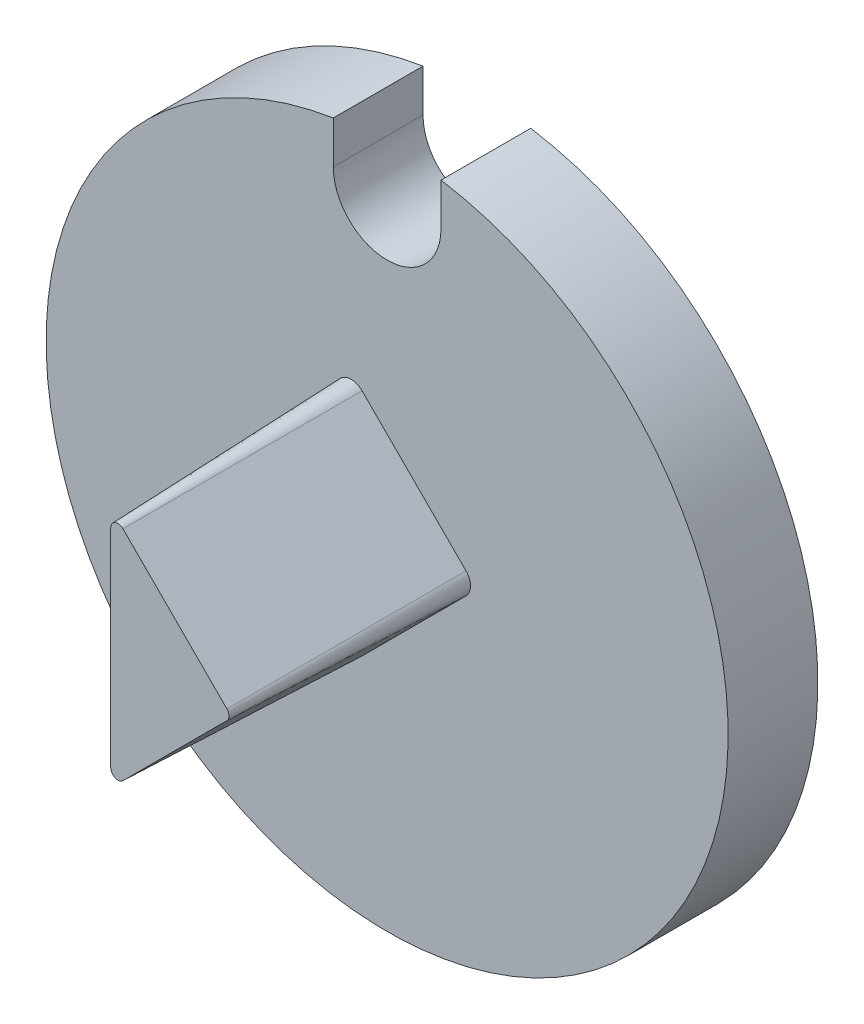
ISO-10303-21;
HEADER;
FILE_DESCRIPTION(('STEP AP214'),'2;1');
FILE_NAME('part.step','',(''),(''),'','','');
FILE_SCHEMA(('AUTOMOTIVE_DESIGN { 1 0 10303 214 1 1 1 1 }'));
ENDSEC;
DATA;
#1=APPLICATION_CONTEXT('core data for automotive mechanical design processes');
#2=APPLICATION_PROTOCOL_DEFINITION('international standard','automotive_design',2000,#1);
#3=PRODUCT_CONTEXT('',#1,'mechanical');
#4=PRODUCT('Part','Part','',(#3));
#5=PRODUCT_RELATED_PRODUCT_CATEGORY('part','',(#4));
#6=PRODUCT_DEFINITION_FORMATION('','',#4);
#7=PRODUCT_DEFINITION_CONTEXT('part definition',#1,'design');
#8=PRODUCT_DEFINITION('design','',#6,#7);
#9=PRODUCT_DEFINITION_SHAPE('','',#8);
#10=(LENGTH_UNIT() NAMED_UNIT(*) SI_UNIT(.MILLI.,.METRE.));
#11=(NAMED_UNIT(*) PLANE_ANGLE_UNIT() SI_UNIT($,.RADIAN.));
#12=(NAMED_UNIT(*) SI_UNIT($,.STERADIAN.) SOLID_ANGLE_UNIT());
#13=UNCERTAINTY_MEASURE_WITH_UNIT(LENGTH_MEASURE(1.E-05),#10,'distance_accuracy_value','');
#14=(GEOMETRIC_REPRESENTATION_CONTEXT(3) GLOBAL_UNCERTAINTY_ASSIGNED_CONTEXT((#13)) GLOBAL_UNIT_ASSIGNED_CONTEXT((#10,
#11,#12)) REPRESENTATION_CONTEXT('',''));
#15=CARTESIAN_POINT('',(0.,0.,0.));
#16=DIRECTION('',(0.,0.,1.));
#17=DIRECTION('',(1.,0.,0.));
#18=AXIS2_PLACEMENT_3D('',#15,#16,#17);
#19=CARTESIAN_POINT('',(1.89644660940672,0.,2.50000000005457));
#20=DIRECTION('',(0.,0.,-1.));
#21=DIRECTION('',(-1.,0.,0.));
#22=AXIS2_PLACEMENT_3D('',#19,#20,#21);
#23=CONICAL_SURFACE('',#22,0.426985001696213,0.0349065850400188);
#24=DIRECTION('',(-0.0246776707783359,0.0246776707783359,0.999390827019096));
#25=VECTOR('',#24,1.);
#26=CARTESIAN_POINT('',(2.03786796564404,-0.141421356237313,9.));
#27=LINE('',#26,#25);
#28=CARTESIAN_POINT('',(2.1983705995712,-0.301923990164476,2.49999999999886));
#29=VERTEX_POINT('',#28);
#30=CARTESIAN_POINT('',(2.03786796564386,-0.141421356237134,9.00000000000728));
#31=VERTEX_POINT('',#30);
#32=EDGE_CURVE('E98',#29,#31,#27,.T.);
#33=ORIENTED_EDGE('',*,*,#32,.F.);
#34=CARTESIAN_POINT('',(1.89644660940672,0.,2.49999999999773));
#35=DIRECTION('',(0.,0.,-1.));
#36=DIRECTION('',(-1.,0.,0.));
#37=AXIS2_PLACEMENT_3D('',#34,#35,#36);
#38=CIRCLE('',#37,0.426985001698198);
#39=CARTESIAN_POINT('',(2.1983705995712,0.301923990164474,2.49999999999886));
#40=VERTEX_POINT('',#39);
#41=EDGE_CURVE('E20',#29,#40,#38,.F.);
#42=ORIENTED_EDGE('',*,*,#41,.T.);
#43=DIRECTION('',(-0.0246776707783359,-0.024677670778336,0.999390827019096));
#44=VECTOR('',#43,1.);
#45=CARTESIAN_POINT('',(2.03786796564404,0.141421356237311,9.));
#46=LINE('',#45,#44);
#47=CARTESIAN_POINT('',(2.03786796564386,0.141421356237131,9.00000000000728));
#48=VERTEX_POINT('',#47);
#49=EDGE_CURVE('E97',#48,#40,#46,.F.);
#50=ORIENTED_EDGE('',*,*,#49,.F.);
#51=CARTESIAN_POINT('',(1.89644660940672,0.,9.00000000001455));
#52=DIRECTION('',(0.,0.,-1.));
#53=DIRECTION('',(-1.,0.,0.));
#54=AXIS2_PLACEMENT_3D('',#51,#52,#53);
#55=CIRCLE('',#54,0.20000000000039);
#56=EDGE_CURVE('E160',#31,#48,#55,.F.);
#57=ORIENTED_EDGE('',*,*,#56,.F.);
#58=EDGE_LOOP('',(#33,#42,#50,#57));
#59=FACE_BOUND('',#58,.T.);
#60=ADVANCED_FACE('F17',(#59),#23,.T.);
#61=CARTESIAN_POINT('',(-1.,-2.89644660940673,2.50000000005457));
#62=DIRECTION('',(0.,0.,-1.));
#63=DIRECTION('',(-1.,0.,0.));
#64=AXIS2_PLACEMENT_3D('',#61,#62,#63);
#65=CONICAL_SURFACE('',#64,0.426985001694135,0.0349065850400188);
#66=DIRECTION('',(0.0348994967025009,0.,0.999390827019096));
#67=VECTOR('',#66,1.);
#68=CARTESIAN_POINT('',(-1.2,-2.89644660940673,9.));
#69=LINE('',#68,#67);
#70=CARTESIAN_POINT('',(-1.4269850016964,-2.89644660940673,2.49999999999886));
#71=VERTEX_POINT('',#70);
#72=CARTESIAN_POINT('',(-1.19999999999975,-2.89644660940673,9.00000000000728));
#73=VERTEX_POINT('',#72);
#74=EDGE_CURVE('E129',#71,#73,#69,.T.);
#75=ORIENTED_EDGE('',*,*,#74,.F.);
#76=CARTESIAN_POINT('',(-1.,-2.89644660940673,2.49999999999773));
#77=DIRECTION('',(0.,0.,-1.));
#78=DIRECTION('',(-1.,0.,0.));
#79=AXIS2_PLACEMENT_3D('',#76,#77,#78);
#80=CIRCLE('',#79,0.42698500169612);
#81=CARTESIAN_POINT('',(-0.698076009835526,-3.1983705995712,2.49999999999886));
#82=VERTEX_POINT('',#81);
#83=EDGE_CURVE('E100',#71,#82,#80,.F.);
#84=ORIENTED_EDGE('',*,*,#83,.T.);
#85=DIRECTION('',(-0.0246776707783359,0.0246776707783359,0.999390827019096));
#86=VECTOR('',#85,1.);
#87=CARTESIAN_POINT('',(-0.85857864376269,-3.03786796564404,9.));
#88=LINE('',#87,#86);
#89=CARTESIAN_POINT('',(-0.85857864376287,-3.03786796564386,9.00000000000728));
#90=VERTEX_POINT('',#89);
#91=EDGE_CURVE('E132',#90,#82,#88,.F.);
#92=ORIENTED_EDGE('',*,*,#91,.F.);
#93=CARTESIAN_POINT('',(-1.,-2.89644660940673,9.00000000001455));
#94=DIRECTION('',(0.,0.,-1.));
#95=DIRECTION('',(-1.,0.,0.));
#96=AXIS2_PLACEMENT_3D('',#93,#94,#95);
#97=CIRCLE('',#96,0.199999999998312);
#98=EDGE_CURVE('E158',#73,#90,#97,.F.);
#99=ORIENTED_EDGE('',*,*,#98,.F.);
#100=EDGE_LOOP('',(#75,#84,#92,#99));
#101=FACE_BOUND('',#100,.T.);
#102=ADVANCED_FACE('F164',(#101),#65,.T.);
#103=CARTESIAN_POINT('',(0.,-0.059584240176571,9.));
#104=DIRECTION('',(0.,0.,1.));
#105=DIRECTION('',(1.,0.,0.));
#106=AXIS2_PLACEMENT_3D('',#103,#104,#105);
#107=PLANE('',#106);
#108=ORIENTED_EDGE('',*,*,#98,.T.);
#109=DIRECTION('',(0.707106781186547,0.707106781186547,0.));
#110=VECTOR('',#109,1.);
#111=CARTESIAN_POINT('',(1.05985254085239,-1.11943678102896,9.));
#112=LINE('',#111,#110);
#113=EDGE_CURVE('E136',#31,#90,#112,.F.);
#114=ORIENTED_EDGE('',*,*,#113,.F.);
#115=ORIENTED_EDGE('',*,*,#56,.T.);
#116=DIRECTION('',(-0.707106781186548,0.707106781186547,0.));
#117=VECTOR('',#116,1.);
#118=CARTESIAN_POINT('',(1.11943678102896,1.05985254085239,9.));
#119=LINE('',#118,#117);
#120=CARTESIAN_POINT('',(-0.858578643762873,3.03786796564386,9.00000000000728));
#121=VERTEX_POINT('',#120);
#122=EDGE_CURVE('E108',#121,#48,#119,.F.);
#123=ORIENTED_EDGE('',*,*,#122,.F.);
#124=CARTESIAN_POINT('',(-1.,2.89644660940673,9.00000000001455));
#125=DIRECTION('',(0.,0.,-1.));
#126=DIRECTION('',(-1.,0.,0.));
#127=AXIS2_PLACEMENT_3D('',#124,#125,#126);
#128=CIRCLE('',#127,0.199999999998312);
#129=CARTESIAN_POINT('',(-1.19999999999975,2.89644660940673,9.00000000000728));
#130=VERTEX_POINT('',#129);
#131=EDGE_CURVE('E156',#130,#121,#128,.T.);
#132=ORIENTED_EDGE('',*,*,#131,.F.);
#133=DIRECTION('',(0.,1.,0.));
#134=VECTOR('',#133,1.);
#135=CARTESIAN_POINT('',(-1.2,-0.0595842401765708,9.));
#136=LINE('',#135,#134);
#137=EDGE_CURVE('E131',#73,#130,#136,.T.);
#138=ORIENTED_EDGE('',*,*,#137,.F.);
#139=EDGE_LOOP('',(#108,#114,#115,#123,#132,#138));
#140=FACE_BOUND('',#139,.T.);
#141=ADVANCED_FACE('F171',(#140),#107,.T.);
#142=CARTESIAN_POINT('',(-1.,2.89644660940673,2.50000000005457));
#143=DIRECTION('',(0.,0.,-1.));
#144=DIRECTION('',(-1.,0.,0.));
#145=AXIS2_PLACEMENT_3D('',#142,#143,#144);
#146=CONICAL_SURFACE('',#145,0.426985001694135,0.0349065850400188);
#147=DIRECTION('',(-0.0246776707783359,-0.024677670778336,0.999390827019096));
#148=VECTOR('',#147,1.);
#149=CARTESIAN_POINT('',(-0.858578643762693,3.03786796564404,9.));
#150=LINE('',#149,#148);
#151=CARTESIAN_POINT('',(-0.698076009835529,3.1983705995712,2.49999999999886));
#152=VERTEX_POINT('',#151);
#153=EDGE_CURVE('E139',#152,#121,#150,.T.);
#154=ORIENTED_EDGE('',*,*,#153,.F.);
#155=CARTESIAN_POINT('',(-1.,2.89644660940673,2.49999999999773));
#156=DIRECTION('',(0.,0.,-1.));
#157=DIRECTION('',(-1.,0.,0.));
#158=AXIS2_PLACEMENT_3D('',#155,#156,#157);
#159=CIRCLE('',#158,0.42698500169612);
#160=CARTESIAN_POINT('',(-1.4269850016964,2.89644660940673,2.49999999999886));
#161=VERTEX_POINT('',#160);
#162=EDGE_CURVE('E113',#152,#161,#159,.F.);
#163=ORIENTED_EDGE('',*,*,#162,.T.);
#164=DIRECTION('',(0.0348994967025009,0.,0.999390827019096));
#165=VECTOR('',#164,1.);
#166=CARTESIAN_POINT('',(-1.2,2.89644660940673,9.));
#167=LINE('',#166,#165);
#168=EDGE_CURVE('E128',#130,#161,#167,.F.);
#169=ORIENTED_EDGE('',*,*,#168,.F.);
#170=ORIENTED_EDGE('',*,*,#131,.T.);
#171=EDGE_LOOP('',(#154,#163,#169,#170));
#172=FACE_BOUND('',#171,.T.);
#173=ADVANCED_FACE('F276',(#172),#146,.T.);
#174=CARTESIAN_POINT('',(1.11943678102896,1.05985254085239,9.));
#175=DIRECTION('',(0.706676030840834,0.706676030840835,0.0348994967025009));
#176=DIRECTION('',(-0.707106781186548,0.707106781186547,0.));
#177=AXIS2_PLACEMENT_3D('',#174,#175,#176);
#178=PLANE('',#177);
#179=ORIENTED_EDGE('',*,*,#49,.T.);
#180=DIRECTION('',(0.707106781186546,-0.707106781186549,0.));
#181=VECTOR('',#180,1.);
#182=CARTESIAN_POINT('',(-0.698076009835555,3.19837059957118,2.5));
#183=LINE('',#182,#181);
#184=EDGE_CURVE('E106',#152,#40,#183,.T.);
#185=ORIENTED_EDGE('',*,*,#184,.F.);
#186=ORIENTED_EDGE('',*,*,#153,.T.);
#187=ORIENTED_EDGE('',*,*,#122,.T.);
#188=EDGE_LOOP('',(#179,#185,#186,#187));
#189=FACE_BOUND('',#188,.T.);
#190=ADVANCED_FACE('F104',(#189),#178,.T.);
#191=CARTESIAN_POINT('',(1.05985254085239,-1.11943678102896,9.));
#192=DIRECTION('',(0.706676030840835,-0.706676030840835,0.0348994967025009));
#193=DIRECTION('',(0.707106781186547,0.707106781186547,0.));
#194=AXIS2_PLACEMENT_3D('',#191,#192,#193);
#195=PLANE('',#194);
#196=ORIENTED_EDGE('',*,*,#91,.T.);
#197=DIRECTION('',(-0.707106781186546,-0.707106781186549,0.));
#198=VECTOR('',#197,1.);
#199=CARTESIAN_POINT('',(2.19837059957117,-0.301923990164446,2.5));
#200=LINE('',#199,#198);
#201=EDGE_CURVE('E115',#29,#82,#200,.T.);
#202=ORIENTED_EDGE('',*,*,#201,.F.);
#203=ORIENTED_EDGE('',*,*,#32,.T.);
#204=ORIENTED_EDGE('',*,*,#113,.T.);
#205=EDGE_LOOP('',(#196,#202,#203,#204));
#206=FACE_BOUND('',#205,.T.);
#207=ADVANCED_FACE('F168',(#206),#195,.T.);
#208=CARTESIAN_POINT('',(-1.2,-0.0595842401765708,9.));
#209=DIRECTION('',(-0.999390827019096,0.,0.0348994967025009));
#210=DIRECTION('',(0.0348994967025009,0.,0.999390827019096));
#211=AXIS2_PLACEMENT_3D('',#208,#209,#210);
#212=PLANE('',#211);
#213=ORIENTED_EDGE('',*,*,#168,.T.);
#214=DIRECTION('',(0.,1.,0.));
#215=VECTOR('',#214,1.);
#216=CARTESIAN_POINT('',(-1.42698500169636,0.,2.5));
#217=LINE('',#216,#215);
#218=EDGE_CURVE('E118',#71,#161,#217,.T.);
#219=ORIENTED_EDGE('',*,*,#218,.F.);
#220=ORIENTED_EDGE('',*,*,#74,.T.);
#221=ORIENTED_EDGE('',*,*,#137,.T.);
#222=EDGE_LOOP('',(#213,#219,#220,#221));
#223=FACE_BOUND('',#222,.T.);
#224=ADVANCED_FACE('F176',(#223),#212,.T.);
#225=CARTESIAN_POINT('',(-1.5,8.79041575982343,27.2542654516506));
#226=DIRECTION('',(1.,0.,0.));
#227=DIRECTION('',(0.,1.,0.));
#228=AXIS2_PLACEMENT_3D('',#225,#226,#227);
#229=PLANE('',#228);
#230=DIRECTION('',(0.,0.,-1.));
#231=VECTOR('',#230,1.);
#232=CARTESIAN_POINT('',(-1.5,9.38083151964686,2.5));
#233=LINE('',#232,#231);
#234=CARTESIAN_POINT('',(-1.5,9.38083151964686,2.5));
#235=VERTEX_POINT('',#234);
#236=CARTESIAN_POINT('',(-1.5,9.38083151964686,0.));
#237=VERTEX_POINT('',#236);
#238=EDGE_CURVE('E154',#235,#237,#233,.T.);
#239=ORIENTED_EDGE('',*,*,#238,.F.);
#240=DIRECTION('',(0.,1.,0.));
#241=VECTOR('',#240,1.);
#242=CARTESIAN_POINT('',(-1.5,0.,2.5));
#243=LINE('',#242,#241);
#244=CARTESIAN_POINT('',(-1.5,8.2,2.5));
#245=VERTEX_POINT('',#244);
#246=EDGE_CURVE('E116',#245,#235,#243,.T.);
#247=ORIENTED_EDGE('',*,*,#246,.F.);
#248=DIRECTION('',(0.,0.,-1.));
#249=VECTOR('',#248,1.);
#250=CARTESIAN_POINT('',(-1.5,8.2,27.2542654516506));
#251=LINE('',#250,#249);
#252=CARTESIAN_POINT('',(-1.5,8.2,0.));
#253=VERTEX_POINT('',#252);
#254=EDGE_CURVE('E181',#245,#253,#251,.T.);
#255=ORIENTED_EDGE('',*,*,#254,.T.);
#256=DIRECTION('',(0.,1.,0.));
#257=VECTOR('',#256,1.);
#258=CARTESIAN_POINT('',(-1.5,8.79041575982343,0.));
#259=LINE('',#258,#257);
#260=EDGE_CURVE('E126',#253,#237,#259,.T.);
#261=ORIENTED_EDGE('',*,*,#260,.T.);
#262=EDGE_LOOP('',(#239,#247,#255,#261));
#263=FACE_BOUND('',#262,.T.);
#264=ADVANCED_FACE('F189',(#263),#229,.T.);
#265=CARTESIAN_POINT('',(1.5,8.79041575982343,27.2542654516506));
#266=DIRECTION('',(-1.,0.,0.));
#267=DIRECTION('',(0.,-1.,0.));
#268=AXIS2_PLACEMENT_3D('',#265,#266,#267);
#269=PLANE('',#268);
#270=DIRECTION('',(0.,0.,-1.));
#271=VECTOR('',#270,1.);
#272=CARTESIAN_POINT('',(1.5,8.2,27.2542654516506));
#273=LINE('',#272,#271);
#274=CARTESIAN_POINT('',(1.5,8.2,0.));
#275=VERTEX_POINT('',#274);
#276=CARTESIAN_POINT('',(1.5,8.2,2.5));
#277=VERTEX_POINT('',#276);
#278=EDGE_CURVE('E150',#275,#277,#273,.F.);
#279=ORIENTED_EDGE('',*,*,#278,.T.);
#280=DIRECTION('',(0.,1.,0.));
#281=VECTOR('',#280,1.);
#282=CARTESIAN_POINT('',(1.5,0.,2.5));
#283=LINE('',#282,#281);
#284=CARTESIAN_POINT('',(1.5,9.38083151964686,2.5));
#285=VERTEX_POINT('',#284);
#286=EDGE_CURVE('E120',#285,#277,#283,.F.);
#287=ORIENTED_EDGE('',*,*,#286,.F.);
#288=DIRECTION('',(0.,0.,-1.));
#289=VECTOR('',#288,1.);
#290=CARTESIAN_POINT('',(1.5,9.38083151964686,2.5));
#291=LINE('',#290,#289);
#292=CARTESIAN_POINT('',(1.5,9.38083151964686,0.));
#293=VERTEX_POINT('',#292);
#294=EDGE_CURVE('E178',#293,#285,#291,.F.);
#295=ORIENTED_EDGE('',*,*,#294,.F.);
#296=DIRECTION('',(0.,-1.,0.));
#297=VECTOR('',#296,1.);
#298=CARTESIAN_POINT('',(1.5,8.79041575982343,0.));
#299=LINE('',#298,#297);
#300=EDGE_CURVE('E35',#293,#275,#299,.T.);
#301=ORIENTED_EDGE('',*,*,#300,.T.);
#302=EDGE_LOOP('',(#279,#287,#295,#301));
#303=FACE_BOUND('',#302,.T.);
#304=ADVANCED_FACE('F200',(#303),#269,.T.);
#305=CARTESIAN_POINT('',(0.,0.,2.5));
#306=DIRECTION('',(0.,0.,1.));
#307=DIRECTION('',(1.,0.,0.));
#308=AXIS2_PLACEMENT_3D('',#305,#306,#307);
#309=PLANE('',#308);
#310=ORIENTED_EDGE('',*,*,#218,.T.);
#311=ORIENTED_EDGE('',*,*,#162,.F.);
#312=ORIENTED_EDGE('',*,*,#184,.T.);
#313=ORIENTED_EDGE('',*,*,#41,.F.);
#314=ORIENTED_EDGE('',*,*,#201,.T.);
#315=ORIENTED_EDGE('',*,*,#83,.F.);
#316=EDGE_LOOP('',(#310,#311,#312,#313,#314,#315));
#317=FACE_BOUND('',#316,.T.);
#318=CARTESIAN_POINT('',(0.,8.2,2.5));
#319=DIRECTION('',(0.,0.,-1.));
#320=DIRECTION('',(-1.,0.,0.));
#321=AXIS2_PLACEMENT_3D('',#318,#319,#320);
#322=CIRCLE('',#321,1.5);
#323=EDGE_CURVE('E147',#277,#245,#322,.T.);
#324=ORIENTED_EDGE('',*,*,#323,.T.);
#325=ORIENTED_EDGE('',*,*,#246,.T.);
#326=CARTESIAN_POINT('',(0.,0.,2.5));
#327=DIRECTION('',(0.,0.,-1.));
#328=DIRECTION('',(-1.,0.,0.));
#329=AXIS2_PLACEMENT_3D('',#326,#327,#328);
#330=CIRCLE('',#329,9.5);
#331=EDGE_CURVE('E151',#285,#235,#330,.T.);
#332=ORIENTED_EDGE('',*,*,#331,.F.);
#333=ORIENTED_EDGE('',*,*,#286,.T.);
#334=EDGE_LOOP('',(#324,#325,#332,#333));
#335=FACE_BOUND('',#334,.T.);
#336=ADVANCED_FACE('F111',(#317,#335),#309,.T.);
#337=CARTESIAN_POINT('',(0.,0.,2.5));
#338=DIRECTION('',(0.,0.,-1.));
#339=DIRECTION('',(-1.,0.,0.));
#340=AXIS2_PLACEMENT_3D('',#337,#338,#339);
#341=CYLINDRICAL_SURFACE('',#340,9.5);
#342=CARTESIAN_POINT('',(0.,0.,0.));
#343=DIRECTION('',(0.,0.,-1.));
#344=DIRECTION('',(-1.,0.,0.));
#345=AXIS2_PLACEMENT_3D('',#342,#343,#344);
#346=CIRCLE('',#345,9.5);
#347=EDGE_CURVE('E26',#237,#293,#346,.F.);
#348=ORIENTED_EDGE('',*,*,#347,.T.);
#349=ORIENTED_EDGE('',*,*,#294,.T.);
#350=ORIENTED_EDGE('',*,*,#331,.T.);
#351=ORIENTED_EDGE('',*,*,#238,.T.);
#352=EDGE_LOOP('',(#348,#349,#350,#351));
#353=FACE_BOUND('',#352,.T.);
#354=ADVANCED_FACE('F198',(#353),#341,.T.);
#355=CARTESIAN_POINT('',(0.,8.2,27.2542654516506));
#356=DIRECTION('',(0.,0.,-1.));
#357=DIRECTION('',(-1.,0.,0.));
#358=AXIS2_PLACEMENT_3D('',#355,#356,#357);
#359=CYLINDRICAL_SURFACE('',#358,1.5);
#360=ORIENTED_EDGE('',*,*,#278,.F.);
#361=CARTESIAN_POINT('',(0.,8.2,0.));
#362=DIRECTION('',(0.,0.,-1.));
#363=DIRECTION('',(-1.,0.,0.));
#364=AXIS2_PLACEMENT_3D('',#361,#362,#363);
#365=CIRCLE('',#364,1.5);
#366=EDGE_CURVE('E11',#275,#253,#365,.T.);
#367=ORIENTED_EDGE('',*,*,#366,.T.);
#368=ORIENTED_EDGE('',*,*,#254,.F.);
#369=ORIENTED_EDGE('',*,*,#323,.F.);
#370=EDGE_LOOP('',(#360,#367,#368,#369));
#371=FACE_BOUND('',#370,.T.);
#372=ADVANCED_FACE('F193',(#371),#359,.F.);
#373=CARTESIAN_POINT('',(0.,0.,0.));
#374=DIRECTION('',(0.,0.,1.));
#375=DIRECTION('',(1.,0.,0.));
#376=AXIS2_PLACEMENT_3D('',#373,#374,#375);
#377=PLANE('',#376);
#378=ORIENTED_EDGE('',*,*,#300,.F.);
#379=ORIENTED_EDGE('',*,*,#347,.F.);
#380=ORIENTED_EDGE('',*,*,#260,.F.);
#381=ORIENTED_EDGE('',*,*,#366,.F.);
#382=EDGE_LOOP('',(#378,#379,#380,#381));
#383=FACE_BOUND('',#382,.T.);
#384=ADVANCED_FACE('F195',(#383),#377,.F.);
#385=CLOSED_SHELL('',(#60,#102,#141,#173,#190,#207,#224,#264,#304,#336,#354,#372,#384));
#386=MANIFOLD_SOLID_BREP('B1',#385);
#387=ADVANCED_BREP_SHAPE_REPRESENTATION('',(#18,#386),#14);
#388=SHAPE_DEFINITION_REPRESENTATION(#9,#387);
ENDSEC;
END-ISO-10303-21;
